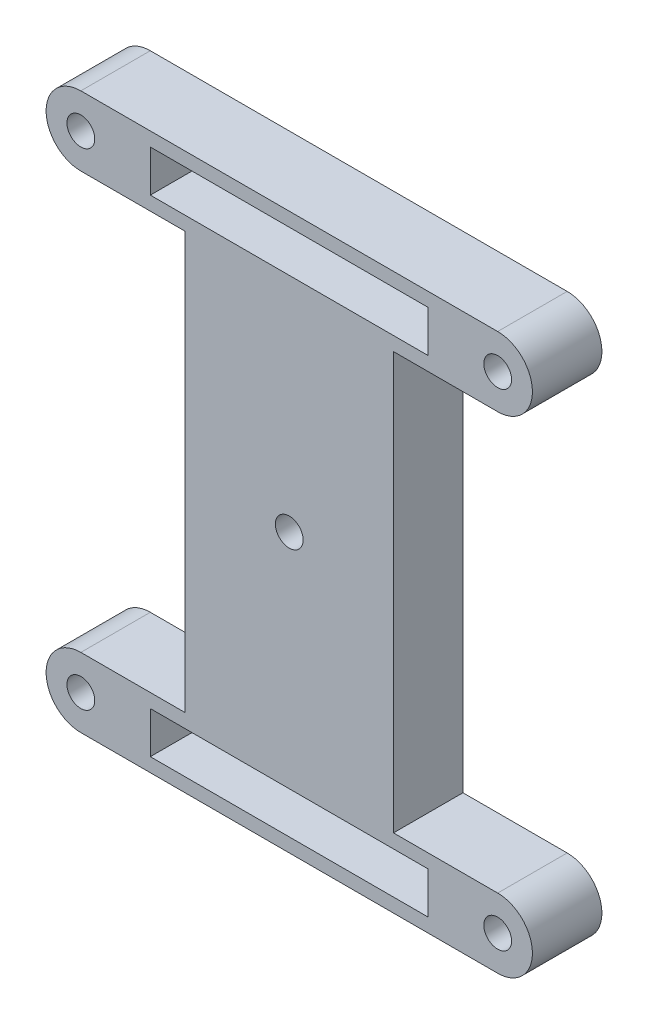
ISO-10303-21;
HEADER;
FILE_DESCRIPTION(('STEP AP214'),'2;1');
FILE_NAME('part.step','',(''),(''),'','','');
FILE_SCHEMA(('AUTOMOTIVE_DESIGN { 1 0 10303 214 1 1 1 1 }'));
ENDSEC;
DATA;
#1=APPLICATION_CONTEXT('core data for automotive mechanical design processes');
#2=APPLICATION_PROTOCOL_DEFINITION('international standard','automotive_design',2000,#1);
#3=PRODUCT_CONTEXT('',#1,'mechanical');
#4=PRODUCT('Part','Part','',(#3));
#5=PRODUCT_RELATED_PRODUCT_CATEGORY('part','',(#4));
#6=PRODUCT_DEFINITION_FORMATION('','',#4);
#7=PRODUCT_DEFINITION_CONTEXT('part definition',#1,'design');
#8=PRODUCT_DEFINITION('design','',#6,#7);
#9=PRODUCT_DEFINITION_SHAPE('','',#8);
#10=(LENGTH_UNIT() NAMED_UNIT(*) SI_UNIT(.MILLI.,.METRE.));
#11=(NAMED_UNIT(*) PLANE_ANGLE_UNIT() SI_UNIT($,.RADIAN.));
#12=(NAMED_UNIT(*) SI_UNIT($,.STERADIAN.) SOLID_ANGLE_UNIT());
#13=UNCERTAINTY_MEASURE_WITH_UNIT(LENGTH_MEASURE(1.E-05),#10,'distance_accuracy_value','');
#14=(GEOMETRIC_REPRESENTATION_CONTEXT(3) GLOBAL_UNCERTAINTY_ASSIGNED_CONTEXT((#13)) GLOBAL_UNIT_ASSIGNED_CONTEXT((#10,
#11,#12)) REPRESENTATION_CONTEXT('',''));
#15=CARTESIAN_POINT('',(0.,0.,0.));
#16=DIRECTION('',(0.,0.,1.));
#17=DIRECTION('',(1.,0.,0.));
#18=AXIS2_PLACEMENT_3D('',#15,#16,#17);
#19=CARTESIAN_POINT('',(15.,-17.5,2.5));
#20=DIRECTION('',(0.,0.,-1.));
#21=DIRECTION('',(-1.,0.,0.));
#22=AXIS2_PLACEMENT_3D('',#19,#20,#21);
#23=PLANE('',#22);
#24=DIRECTION('',(1.,0.,0.));
#25=VECTOR('',#24,1.);
#26=CARTESIAN_POINT('',(-10.,16.,2.5));
#27=LINE('',#26,#25);
#28=CARTESIAN_POINT('',(-10.,16.,2.5));
#29=VERTEX_POINT('',#28);
#30=CARTESIAN_POINT('',(10.,16.,2.5));
#31=VERTEX_POINT('',#30);
#32=EDGE_CURVE('E200',#29,#31,#27,.T.);
#33=ORIENTED_EDGE('',*,*,#32,.F.);
#34=DIRECTION('',(0.,-1.,0.));
#35=VECTOR('',#34,1.);
#36=CARTESIAN_POINT('',(-10.,19.,2.5));
#37=LINE('',#36,#35);
#38=CARTESIAN_POINT('',(-10.,19.,2.5));
#39=VERTEX_POINT('',#38);
#40=EDGE_CURVE('E48',#39,#29,#37,.T.);
#41=ORIENTED_EDGE('',*,*,#40,.F.);
#42=DIRECTION('',(-1.,0.,0.));
#43=VECTOR('',#42,1.);
#44=CARTESIAN_POINT('',(-10.,19.,2.5));
#45=LINE('',#44,#43);
#46=CARTESIAN_POINT('',(10.,19.,2.5));
#47=VERTEX_POINT('',#46);
#48=EDGE_CURVE('E191',#47,#39,#45,.T.);
#49=ORIENTED_EDGE('',*,*,#48,.F.);
#50=DIRECTION('',(0.,1.,0.));
#51=VECTOR('',#50,1.);
#52=CARTESIAN_POINT('',(10.,19.,2.5));
#53=LINE('',#52,#51);
#54=EDGE_CURVE('E194',#31,#47,#53,.T.);
#55=ORIENTED_EDGE('',*,*,#54,.F.);
#56=EDGE_LOOP('',(#33,#41,#49,#55));
#57=FACE_BOUND('',#56,.T.);
#58=DIRECTION('',(0.,1.,0.));
#59=VECTOR('',#58,1.);
#60=CARTESIAN_POINT('',(9.99999999999997,-19.,2.5));
#61=LINE('',#60,#59);
#62=CARTESIAN_POINT('',(9.99999999999997,-19.,2.5));
#63=VERTEX_POINT('',#62);
#64=CARTESIAN_POINT('',(9.99999999999998,-16.,2.5));
#65=VERTEX_POINT('',#64);
#66=EDGE_CURVE('E226',#63,#65,#61,.T.);
#67=ORIENTED_EDGE('',*,*,#66,.F.);
#68=DIRECTION('',(1.,0.,0.));
#69=VECTOR('',#68,1.);
#70=CARTESIAN_POINT('',(-10.,-19.,2.5));
#71=LINE('',#70,#69);
#72=CARTESIAN_POINT('',(-10.,-19.,2.5));
#73=VERTEX_POINT('',#72);
#74=EDGE_CURVE('E56',#73,#63,#71,.T.);
#75=ORIENTED_EDGE('',*,*,#74,.F.);
#76=DIRECTION('',(0.,-1.,0.));
#77=VECTOR('',#76,1.);
#78=CARTESIAN_POINT('',(-10.,-19.,2.5));
#79=LINE('',#78,#77);
#80=CARTESIAN_POINT('',(-10.,-16.,2.5));
#81=VERTEX_POINT('',#80);
#82=EDGE_CURVE('E215',#81,#73,#79,.T.);
#83=ORIENTED_EDGE('',*,*,#82,.F.);
#84=DIRECTION('',(-1.,0.,0.));
#85=VECTOR('',#84,1.);
#86=CARTESIAN_POINT('',(-10.,-16.,2.5));
#87=LINE('',#86,#85);
#88=EDGE_CURVE('E229',#65,#81,#87,.T.);
#89=ORIENTED_EDGE('',*,*,#88,.F.);
#90=EDGE_LOOP('',(#67,#75,#83,#89));
#91=FACE_BOUND('',#90,.T.);
#92=CARTESIAN_POINT('',(0.,0.,2.5));
#93=DIRECTION('',(0.,0.,1.));
#94=DIRECTION('',(1.,0.,0.));
#95=AXIS2_PLACEMENT_3D('',#92,#93,#94);
#96=CIRCLE('',#95,1.);
#97=CARTESIAN_POINT('',(1.,0.,2.5));
#98=VERTEX_POINT('',#97);
#99=EDGE_CURVE('E207',#98,#98,#96,.T.);
#100=ORIENTED_EDGE('',*,*,#99,.F.);
#101=EDGE_LOOP('',(#100));
#102=FACE_BOUND('',#101,.T.);
#103=DIRECTION('',(-1.,0.,0.));
#104=VECTOR('',#103,1.);
#105=CARTESIAN_POINT('',(7.5,-15.,2.5));
#106=LINE('',#105,#104);
#107=CARTESIAN_POINT('',(15.,-15.,2.5));
#108=VERTEX_POINT('',#107);
#109=CARTESIAN_POINT('',(7.5,-15.,2.5));
#110=VERTEX_POINT('',#109);
#111=EDGE_CURVE('E270',#108,#110,#106,.T.);
#112=ORIENTED_EDGE('',*,*,#111,.T.);
#113=DIRECTION('',(0.,1.,0.));
#114=VECTOR('',#113,1.);
#115=CARTESIAN_POINT('',(7.5,15.,2.5));
#116=LINE('',#115,#114);
#117=CARTESIAN_POINT('',(7.5,15.,2.5));
#118=VERTEX_POINT('',#117);
#119=EDGE_CURVE('E273',#110,#118,#116,.T.);
#120=ORIENTED_EDGE('',*,*,#119,.T.);
#121=DIRECTION('',(1.,0.,0.));
#122=VECTOR('',#121,1.);
#123=CARTESIAN_POINT('',(7.5,15.,2.5));
#124=LINE('',#123,#122);
#125=CARTESIAN_POINT('',(15.,15.,2.5));
#126=VERTEX_POINT('',#125);
#127=EDGE_CURVE('E276',#118,#126,#124,.T.);
#128=ORIENTED_EDGE('',*,*,#127,.T.);
#129=CARTESIAN_POINT('',(15.,17.5,2.5));
#130=DIRECTION('',(0.,0.,1.));
#131=DIRECTION('',(1.,0.,0.));
#132=AXIS2_PLACEMENT_3D('',#129,#130,#131);
#133=CIRCLE('',#132,2.5);
#134=CARTESIAN_POINT('',(15.,20.,2.5));
#135=VERTEX_POINT('',#134);
#136=EDGE_CURVE('E278',#126,#135,#133,.T.);
#137=ORIENTED_EDGE('',*,*,#136,.T.);
#138=DIRECTION('',(-1.,0.,0.));
#139=VECTOR('',#138,1.);
#140=CARTESIAN_POINT('',(-15.,20.,2.5));
#141=LINE('',#140,#139);
#142=CARTESIAN_POINT('',(-15.,20.,2.5));
#143=VERTEX_POINT('',#142);
#144=EDGE_CURVE('E280',#135,#143,#141,.T.);
#145=ORIENTED_EDGE('',*,*,#144,.T.);
#146=CARTESIAN_POINT('',(-15.,17.5,2.5));
#147=DIRECTION('',(0.,0.,1.));
#148=DIRECTION('',(1.,0.,0.));
#149=AXIS2_PLACEMENT_3D('',#146,#147,#148);
#150=CIRCLE('',#149,2.5);
#151=CARTESIAN_POINT('',(-15.,15.,2.5));
#152=VERTEX_POINT('',#151);
#153=EDGE_CURVE('E282',#143,#152,#150,.T.);
#154=ORIENTED_EDGE('',*,*,#153,.T.);
#155=DIRECTION('',(1.,0.,0.));
#156=VECTOR('',#155,1.);
#157=CARTESIAN_POINT('',(-15.,15.,2.5));
#158=LINE('',#157,#156);
#159=CARTESIAN_POINT('',(-7.5,15.,2.5));
#160=VERTEX_POINT('',#159);
#161=EDGE_CURVE('E284',#152,#160,#158,.T.);
#162=ORIENTED_EDGE('',*,*,#161,.T.);
#163=DIRECTION('',(0.,-1.,0.));
#164=VECTOR('',#163,1.);
#165=CARTESIAN_POINT('',(-7.5,15.,2.5));
#166=LINE('',#165,#164);
#167=CARTESIAN_POINT('',(-7.5,-15.,2.5));
#168=VERTEX_POINT('',#167);
#169=EDGE_CURVE('E286',#160,#168,#166,.T.);
#170=ORIENTED_EDGE('',*,*,#169,.T.);
#171=DIRECTION('',(-1.,0.,0.));
#172=VECTOR('',#171,1.);
#173=CARTESIAN_POINT('',(-15.,-15.,2.5));
#174=LINE('',#173,#172);
#175=CARTESIAN_POINT('',(-15.,-15.,2.5));
#176=VERTEX_POINT('',#175);
#177=EDGE_CURVE('E288',#168,#176,#174,.T.);
#178=ORIENTED_EDGE('',*,*,#177,.T.);
#179=CARTESIAN_POINT('',(-15.,-17.5,2.5));
#180=DIRECTION('',(0.,0.,1.));
#181=DIRECTION('',(-1.,0.,0.));
#182=AXIS2_PLACEMENT_3D('',#179,#180,#181);
#183=CIRCLE('',#182,2.5);
#184=CARTESIAN_POINT('',(-15.,-20.,2.5));
#185=VERTEX_POINT('',#184);
#186=EDGE_CURVE('E290',#176,#185,#183,.T.);
#187=ORIENTED_EDGE('',*,*,#186,.T.);
#188=DIRECTION('',(1.,0.,0.));
#189=VECTOR('',#188,1.);
#190=CARTESIAN_POINT('',(-15.,-20.,2.5));
#191=LINE('',#190,#189);
#192=CARTESIAN_POINT('',(15.,-20.,2.5));
#193=VERTEX_POINT('',#192);
#194=EDGE_CURVE('E292',#185,#193,#191,.T.);
#195=ORIENTED_EDGE('',*,*,#194,.T.);
#196=CARTESIAN_POINT('',(15.,-17.5,2.5));
#197=DIRECTION('',(0.,0.,1.));
#198=DIRECTION('',(-1.,0.,0.));
#199=AXIS2_PLACEMENT_3D('',#196,#197,#198);
#200=CIRCLE('',#199,2.5);
#201=EDGE_CURVE('E294',#193,#108,#200,.T.);
#202=ORIENTED_EDGE('',*,*,#201,.T.);
#203=EDGE_LOOP('',(#112,#120,#128,#137,#145,#154,#162,#170,#178,#187,#195,#202));
#204=FACE_BOUND('',#203,.T.);
#205=CARTESIAN_POINT('',(15.,17.5,2.5));
#206=DIRECTION('',(0.,0.,1.));
#207=DIRECTION('',(1.,0.,0.));
#208=AXIS2_PLACEMENT_3D('',#205,#206,#207);
#209=CIRCLE('',#208,1.);
#210=CARTESIAN_POINT('',(16.,17.5,2.5));
#211=VERTEX_POINT('',#210);
#212=EDGE_CURVE('E264',#211,#211,#209,.T.);
#213=ORIENTED_EDGE('',*,*,#212,.F.);
#214=EDGE_LOOP('',(#213));
#215=FACE_BOUND('',#214,.T.);
#216=CARTESIAN_POINT('',(15.,-17.5,2.5));
#217=DIRECTION('',(0.,0.,1.));
#218=DIRECTION('',(-1.,0.,0.));
#219=AXIS2_PLACEMENT_3D('',#216,#217,#218);
#220=CIRCLE('',#219,1.);
#221=CARTESIAN_POINT('',(14.,-17.5,2.5));
#222=VERTEX_POINT('',#221);
#223=EDGE_CURVE('E258',#222,#222,#220,.T.);
#224=ORIENTED_EDGE('',*,*,#223,.F.);
#225=EDGE_LOOP('',(#224));
#226=FACE_BOUND('',#225,.T.);
#227=CARTESIAN_POINT('',(-15.,-17.5,2.5));
#228=DIRECTION('',(0.,0.,1.));
#229=DIRECTION('',(-1.,0.,0.));
#230=AXIS2_PLACEMENT_3D('',#227,#228,#229);
#231=CIRCLE('',#230,1.);
#232=CARTESIAN_POINT('',(-16.,-17.5,2.5));
#233=VERTEX_POINT('',#232);
#234=EDGE_CURVE('E252',#233,#233,#231,.T.);
#235=ORIENTED_EDGE('',*,*,#234,.F.);
#236=EDGE_LOOP('',(#235));
#237=FACE_BOUND('',#236,.T.);
#238=CARTESIAN_POINT('',(-15.,17.5,2.5));
#239=DIRECTION('',(0.,0.,1.));
#240=DIRECTION('',(1.,0.,0.));
#241=AXIS2_PLACEMENT_3D('',#238,#239,#240);
#242=CIRCLE('',#241,1.);
#243=CARTESIAN_POINT('',(-14.,17.5,2.5));
#244=VERTEX_POINT('',#243);
#245=EDGE_CURVE('E246',#244,#244,#242,.T.);
#246=ORIENTED_EDGE('',*,*,#245,.F.);
#247=EDGE_LOOP('',(#246));
#248=FACE_BOUND('',#247,.T.);
#249=ADVANCED_FACE('F33',(#57,#91,#102,#204,#215,#226,#237,#248),#23,.F.);
#250=CARTESIAN_POINT('',(15.,-17.5,-2.5));
#251=DIRECTION('',(0.,0.,-1.));
#252=DIRECTION('',(-1.,0.,0.));
#253=AXIS2_PLACEMENT_3D('',#250,#251,#252);
#254=PLANE('',#253);
#255=DIRECTION('',(0.,-1.,0.));
#256=VECTOR('',#255,1.);
#257=CARTESIAN_POINT('',(-10.,19.,-2.5));
#258=LINE('',#257,#256);
#259=CARTESIAN_POINT('',(-10.,19.,-2.5));
#260=VERTEX_POINT('',#259);
#261=CARTESIAN_POINT('',(-10.,16.,-2.5));
#262=VERTEX_POINT('',#261);
#263=EDGE_CURVE('E172',#260,#262,#258,.T.);
#264=ORIENTED_EDGE('',*,*,#263,.T.);
#265=DIRECTION('',(1.,0.,0.));
#266=VECTOR('',#265,1.);
#267=CARTESIAN_POINT('',(-10.,16.,-2.5));
#268=LINE('',#267,#266);
#269=CARTESIAN_POINT('',(10.,16.,-2.5));
#270=VERTEX_POINT('',#269);
#271=EDGE_CURVE('E182',#262,#270,#268,.T.);
#272=ORIENTED_EDGE('',*,*,#271,.T.);
#273=DIRECTION('',(0.,1.,0.));
#274=VECTOR('',#273,1.);
#275=CARTESIAN_POINT('',(10.,19.,-2.5));
#276=LINE('',#275,#274);
#277=CARTESIAN_POINT('',(10.,19.,-2.5));
#278=VERTEX_POINT('',#277);
#279=EDGE_CURVE('E186',#270,#278,#276,.T.);
#280=ORIENTED_EDGE('',*,*,#279,.T.);
#281=DIRECTION('',(-1.,0.,0.));
#282=VECTOR('',#281,1.);
#283=CARTESIAN_POINT('',(-10.,19.,-2.5));
#284=LINE('',#283,#282);
#285=EDGE_CURVE('E178',#278,#260,#284,.T.);
#286=ORIENTED_EDGE('',*,*,#285,.T.);
#287=EDGE_LOOP('',(#264,#272,#280,#286));
#288=FACE_BOUND('',#287,.T.);
#289=DIRECTION('',(1.,0.,0.));
#290=VECTOR('',#289,1.);
#291=CARTESIAN_POINT('',(-10.,-19.,-2.5));
#292=LINE('',#291,#290);
#293=CARTESIAN_POINT('',(-10.,-19.,-2.5));
#294=VERTEX_POINT('',#293);
#295=CARTESIAN_POINT('',(9.99999999999997,-19.,-2.5));
#296=VERTEX_POINT('',#295);
#297=EDGE_CURVE('E211',#294,#296,#292,.T.);
#298=ORIENTED_EDGE('',*,*,#297,.T.);
#299=DIRECTION('',(0.,1.,0.));
#300=VECTOR('',#299,1.);
#301=CARTESIAN_POINT('',(9.99999999999997,-19.,-2.5));
#302=LINE('',#301,#300);
#303=CARTESIAN_POINT('',(9.99999999999998,-16.,-2.5));
#304=VERTEX_POINT('',#303);
#305=EDGE_CURVE('E214',#296,#304,#302,.T.);
#306=ORIENTED_EDGE('',*,*,#305,.T.);
#307=DIRECTION('',(-1.,0.,0.));
#308=VECTOR('',#307,1.);
#309=CARTESIAN_POINT('',(-10.,-16.,-2.5));
#310=LINE('',#309,#308);
#311=CARTESIAN_POINT('',(-10.,-16.,-2.5));
#312=VERTEX_POINT('',#311);
#313=EDGE_CURVE('E218',#304,#312,#310,.T.);
#314=ORIENTED_EDGE('',*,*,#313,.T.);
#315=DIRECTION('',(0.,-1.,0.));
#316=VECTOR('',#315,1.);
#317=CARTESIAN_POINT('',(-10.,-19.,-2.5));
#318=LINE('',#317,#316);
#319=EDGE_CURVE('E221',#312,#294,#318,.T.);
#320=ORIENTED_EDGE('',*,*,#319,.T.);
#321=EDGE_LOOP('',(#298,#306,#314,#320));
#322=FACE_BOUND('',#321,.T.);
#323=CARTESIAN_POINT('',(0.,0.,-2.5));
#324=DIRECTION('',(0.,0.,1.));
#325=DIRECTION('',(1.,0.,0.));
#326=AXIS2_PLACEMENT_3D('',#323,#324,#325);
#327=CIRCLE('',#326,1.);
#328=CARTESIAN_POINT('',(1.,0.,-2.5));
#329=VERTEX_POINT('',#328);
#330=EDGE_CURVE('E240',#329,#329,#327,.T.);
#331=ORIENTED_EDGE('',*,*,#330,.T.);
#332=EDGE_LOOP('',(#331));
#333=FACE_BOUND('',#332,.T.);
#334=CARTESIAN_POINT('',(-15.,-17.5,-2.5));
#335=DIRECTION('',(0.,0.,1.));
#336=DIRECTION('',(-1.,0.,0.));
#337=AXIS2_PLACEMENT_3D('',#334,#335,#336);
#338=CIRCLE('',#337,1.);
#339=CARTESIAN_POINT('',(-16.,-17.5,-2.5));
#340=VERTEX_POINT('',#339);
#341=EDGE_CURVE('E249',#340,#340,#338,.T.);
#342=ORIENTED_EDGE('',*,*,#341,.T.);
#343=EDGE_LOOP('',(#342));
#344=FACE_BOUND('',#343,.T.);
#345=CARTESIAN_POINT('',(15.,17.5,-2.5));
#346=DIRECTION('',(0.,0.,1.));
#347=DIRECTION('',(1.,0.,0.));
#348=AXIS2_PLACEMENT_3D('',#345,#346,#347);
#349=CIRCLE('',#348,1.);
#350=CARTESIAN_POINT('',(16.,17.5,-2.5));
#351=VERTEX_POINT('',#350);
#352=EDGE_CURVE('E261',#351,#351,#349,.T.);
#353=ORIENTED_EDGE('',*,*,#352,.T.);
#354=EDGE_LOOP('',(#353));
#355=FACE_BOUND('',#354,.T.);
#356=DIRECTION('',(-1.,0.,0.));
#357=VECTOR('',#356,1.);
#358=CARTESIAN_POINT('',(7.5,-15.,-2.5));
#359=LINE('',#358,#357);
#360=CARTESIAN_POINT('',(15.,-15.,-2.5));
#361=VERTEX_POINT('',#360);
#362=CARTESIAN_POINT('',(7.5,-15.,-2.5));
#363=VERTEX_POINT('',#362);
#364=EDGE_CURVE('E267',#361,#363,#359,.T.);
#365=ORIENTED_EDGE('',*,*,#364,.F.);
#366=CARTESIAN_POINT('',(15.,-17.5,-2.5));
#367=DIRECTION('',(0.,0.,1.));
#368=DIRECTION('',(-1.,0.,0.));
#369=AXIS2_PLACEMENT_3D('',#366,#367,#368);
#370=CIRCLE('',#369,2.5);
#371=CARTESIAN_POINT('',(15.,-20.,-2.5));
#372=VERTEX_POINT('',#371);
#373=EDGE_CURVE('E274',#372,#361,#370,.T.);
#374=ORIENTED_EDGE('',*,*,#373,.F.);
#375=DIRECTION('',(1.,0.,0.));
#376=VECTOR('',#375,1.);
#377=CARTESIAN_POINT('',(-15.,-20.,-2.5));
#378=LINE('',#377,#376);
#379=CARTESIAN_POINT('',(-15.,-20.,-2.5));
#380=VERTEX_POINT('',#379);
#381=EDGE_CURVE('E317',#380,#372,#378,.T.);
#382=ORIENTED_EDGE('',*,*,#381,.F.);
#383=CARTESIAN_POINT('',(-15.,-17.5,-2.5));
#384=DIRECTION('',(0.,0.,1.));
#385=DIRECTION('',(-1.,0.,0.));
#386=AXIS2_PLACEMENT_3D('',#383,#384,#385);
#387=CIRCLE('',#386,2.5);
#388=CARTESIAN_POINT('',(-15.,-15.,-2.5));
#389=VERTEX_POINT('',#388);
#390=EDGE_CURVE('E315',#389,#380,#387,.T.);
#391=ORIENTED_EDGE('',*,*,#390,.F.);
#392=DIRECTION('',(-1.,0.,0.));
#393=VECTOR('',#392,1.);
#394=CARTESIAN_POINT('',(-15.,-15.,-2.5));
#395=LINE('',#394,#393);
#396=CARTESIAN_POINT('',(-7.5,-15.,-2.5));
#397=VERTEX_POINT('',#396);
#398=EDGE_CURVE('E313',#397,#389,#395,.T.);
#399=ORIENTED_EDGE('',*,*,#398,.F.);
#400=DIRECTION('',(0.,-1.,0.));
#401=VECTOR('',#400,1.);
#402=CARTESIAN_POINT('',(-7.5,15.,-2.5));
#403=LINE('',#402,#401);
#404=CARTESIAN_POINT('',(-7.5,15.,-2.5));
#405=VERTEX_POINT('',#404);
#406=EDGE_CURVE('E311',#405,#397,#403,.T.);
#407=ORIENTED_EDGE('',*,*,#406,.F.);
#408=DIRECTION('',(1.,0.,0.));
#409=VECTOR('',#408,1.);
#410=CARTESIAN_POINT('',(-15.,15.,-2.5));
#411=LINE('',#410,#409);
#412=CARTESIAN_POINT('',(-15.,15.,-2.5));
#413=VERTEX_POINT('',#412);
#414=EDGE_CURVE('E309',#413,#405,#411,.T.);
#415=ORIENTED_EDGE('',*,*,#414,.F.);
#416=CARTESIAN_POINT('',(-15.,17.5,-2.5));
#417=DIRECTION('',(0.,0.,1.));
#418=DIRECTION('',(1.,0.,0.));
#419=AXIS2_PLACEMENT_3D('',#416,#417,#418);
#420=CIRCLE('',#419,2.5);
#421=CARTESIAN_POINT('',(-15.,20.,-2.5));
#422=VERTEX_POINT('',#421);
#423=EDGE_CURVE('E307',#422,#413,#420,.T.);
#424=ORIENTED_EDGE('',*,*,#423,.F.);
#425=DIRECTION('',(-1.,0.,0.));
#426=VECTOR('',#425,1.);
#427=CARTESIAN_POINT('',(-15.,20.,-2.5));
#428=LINE('',#427,#426);
#429=CARTESIAN_POINT('',(15.,20.,-2.5));
#430=VERTEX_POINT('',#429);
#431=EDGE_CURVE('E305',#430,#422,#428,.T.);
#432=ORIENTED_EDGE('',*,*,#431,.F.);
#433=CARTESIAN_POINT('',(15.,17.5,-2.5));
#434=DIRECTION('',(0.,0.,1.));
#435=DIRECTION('',(1.,0.,0.));
#436=AXIS2_PLACEMENT_3D('',#433,#434,#435);
#437=CIRCLE('',#436,2.5);
#438=CARTESIAN_POINT('',(15.,15.,-2.5));
#439=VERTEX_POINT('',#438);
#440=EDGE_CURVE('E303',#439,#430,#437,.T.);
#441=ORIENTED_EDGE('',*,*,#440,.F.);
#442=DIRECTION('',(1.,0.,0.));
#443=VECTOR('',#442,1.);
#444=CARTESIAN_POINT('',(7.5,15.,-2.5));
#445=LINE('',#444,#443);
#446=CARTESIAN_POINT('',(7.5,15.,-2.5));
#447=VERTEX_POINT('',#446);
#448=EDGE_CURVE('E301',#447,#439,#445,.T.);
#449=ORIENTED_EDGE('',*,*,#448,.F.);
#450=DIRECTION('',(0.,1.,0.));
#451=VECTOR('',#450,1.);
#452=CARTESIAN_POINT('',(7.5,15.,-2.5));
#453=LINE('',#452,#451);
#454=EDGE_CURVE('E299',#363,#447,#453,.T.);
#455=ORIENTED_EDGE('',*,*,#454,.F.);
#456=EDGE_LOOP('',(#365,#374,#382,#391,#399,#407,#415,#424,#432,#441,#449,#455));
#457=FACE_BOUND('',#456,.T.);
#458=CARTESIAN_POINT('',(15.,-17.5,-2.5));
#459=DIRECTION('',(0.,0.,1.));
#460=DIRECTION('',(-1.,0.,0.));
#461=AXIS2_PLACEMENT_3D('',#458,#459,#460);
#462=CIRCLE('',#461,1.);
#463=CARTESIAN_POINT('',(14.,-17.5,-2.5));
#464=VERTEX_POINT('',#463);
#465=EDGE_CURVE('E255',#464,#464,#462,.T.);
#466=ORIENTED_EDGE('',*,*,#465,.T.);
#467=EDGE_LOOP('',(#466));
#468=FACE_BOUND('',#467,.T.);
#469=CARTESIAN_POINT('',(-15.,17.5,-2.5));
#470=DIRECTION('',(0.,0.,1.));
#471=DIRECTION('',(1.,0.,0.));
#472=AXIS2_PLACEMENT_3D('',#469,#470,#471);
#473=CIRCLE('',#472,1.);
#474=CARTESIAN_POINT('',(-14.,17.5,-2.5));
#475=VERTEX_POINT('',#474);
#476=EDGE_CURVE('E243',#475,#475,#473,.T.);
#477=ORIENTED_EDGE('',*,*,#476,.T.);
#478=EDGE_LOOP('',(#477));
#479=FACE_BOUND('',#478,.T.);
#480=ADVANCED_FACE('F188',(#288,#322,#333,#344,#355,#457,#468,#479),#254,.T.);
#481=CARTESIAN_POINT('',(7.5,-15.,2.5));
#482=DIRECTION('',(0.,-1.,0.));
#483=DIRECTION('',(1.,0.,0.));
#484=AXIS2_PLACEMENT_3D('',#481,#482,#483);
#485=PLANE('',#484);
#486=ORIENTED_EDGE('',*,*,#364,.T.);
#487=DIRECTION('',(0.,0.,-1.));
#488=VECTOR('',#487,1.);
#489=CARTESIAN_POINT('',(7.5,-15.,2.5));
#490=LINE('',#489,#488);
#491=EDGE_CURVE('E11',#110,#363,#490,.T.);
#492=ORIENTED_EDGE('',*,*,#491,.F.);
#493=ORIENTED_EDGE('',*,*,#111,.F.);
#494=DIRECTION('',(0.,0.,-1.));
#495=VECTOR('',#494,1.);
#496=CARTESIAN_POINT('',(15.,-15.,2.5));
#497=LINE('',#496,#495);
#498=EDGE_CURVE('E296',#108,#361,#497,.T.);
#499=ORIENTED_EDGE('',*,*,#498,.T.);
#500=EDGE_LOOP('',(#486,#492,#493,#499));
#501=FACE_BOUND('',#500,.T.);
#502=ADVANCED_FACE('F35',(#501),#485,.F.);
#503=CARTESIAN_POINT('',(7.5,15.,2.5));
#504=DIRECTION('',(-1.,0.,0.));
#505=DIRECTION('',(0.,-1.,0.));
#506=AXIS2_PLACEMENT_3D('',#503,#504,#505);
#507=PLANE('',#506);
#508=ORIENTED_EDGE('',*,*,#454,.T.);
#509=DIRECTION('',(0.,0.,-1.));
#510=VECTOR('',#509,1.);
#511=CARTESIAN_POINT('',(7.5,15.,2.5));
#512=LINE('',#511,#510);
#513=EDGE_CURVE('E41',#118,#447,#512,.T.);
#514=ORIENTED_EDGE('',*,*,#513,.F.);
#515=ORIENTED_EDGE('',*,*,#119,.F.);
#516=ORIENTED_EDGE('',*,*,#491,.T.);
#517=EDGE_LOOP('',(#508,#514,#515,#516));
#518=FACE_BOUND('',#517,.T.);
#519=ADVANCED_FACE('F376',(#518),#507,.F.);
#520=CARTESIAN_POINT('',(7.5,15.,2.5));
#521=DIRECTION('',(0.,1.,0.));
#522=DIRECTION('',(-1.,0.,0.));
#523=AXIS2_PLACEMENT_3D('',#520,#521,#522);
#524=PLANE('',#523);
#525=ORIENTED_EDGE('',*,*,#448,.T.);
#526=DIRECTION('',(0.,0.,-1.));
#527=VECTOR('',#526,1.);
#528=CARTESIAN_POINT('',(15.,15.,2.5));
#529=LINE('',#528,#527);
#530=EDGE_CURVE('E346',#126,#439,#529,.T.);
#531=ORIENTED_EDGE('',*,*,#530,.F.);
#532=ORIENTED_EDGE('',*,*,#127,.F.);
#533=ORIENTED_EDGE('',*,*,#513,.T.);
#534=EDGE_LOOP('',(#525,#531,#532,#533));
#535=FACE_BOUND('',#534,.T.);
#536=ADVANCED_FACE('F353',(#535),#524,.F.);
#537=CARTESIAN_POINT('',(15.,17.5,2.5));
#538=DIRECTION('',(0.,0.,-1.));
#539=DIRECTION('',(-1.,0.,0.));
#540=AXIS2_PLACEMENT_3D('',#537,#538,#539);
#541=CYLINDRICAL_SURFACE('',#540,2.5);
#542=ORIENTED_EDGE('',*,*,#440,.T.);
#543=DIRECTION('',(0.,0.,-1.));
#544=VECTOR('',#543,1.);
#545=CARTESIAN_POINT('',(15.,20.,2.5));
#546=LINE('',#545,#544);
#547=EDGE_CURVE('E343',#135,#430,#546,.T.);
#548=ORIENTED_EDGE('',*,*,#547,.F.);
#549=ORIENTED_EDGE('',*,*,#136,.F.);
#550=ORIENTED_EDGE('',*,*,#530,.T.);
#551=EDGE_LOOP('',(#542,#548,#549,#550));
#552=FACE_BOUND('',#551,.T.);
#553=ADVANCED_FACE('F364',(#552),#541,.T.);
#554=CARTESIAN_POINT('',(-15.,20.,2.5));
#555=DIRECTION('',(0.,-1.,0.));
#556=DIRECTION('',(0.,0.,-1.));
#557=AXIS2_PLACEMENT_3D('',#554,#555,#556);
#558=PLANE('',#557);
#559=ORIENTED_EDGE('',*,*,#431,.T.);
#560=DIRECTION('',(0.,0.,-1.));
#561=VECTOR('',#560,1.);
#562=CARTESIAN_POINT('',(-15.,20.,2.5));
#563=LINE('',#562,#561);
#564=EDGE_CURVE('E340',#143,#422,#563,.T.);
#565=ORIENTED_EDGE('',*,*,#564,.F.);
#566=ORIENTED_EDGE('',*,*,#144,.F.);
#567=ORIENTED_EDGE('',*,*,#547,.T.);
#568=EDGE_LOOP('',(#559,#565,#566,#567));
#569=FACE_BOUND('',#568,.T.);
#570=ADVANCED_FACE('F368',(#569),#558,.F.);
#571=CARTESIAN_POINT('',(-15.,17.5,2.5));
#572=DIRECTION('',(0.,0.,-1.));
#573=DIRECTION('',(-1.,0.,0.));
#574=AXIS2_PLACEMENT_3D('',#571,#572,#573);
#575=CYLINDRICAL_SURFACE('',#574,2.5);
#576=ORIENTED_EDGE('',*,*,#423,.T.);
#577=DIRECTION('',(0.,0.,-1.));
#578=VECTOR('',#577,1.);
#579=CARTESIAN_POINT('',(-15.,15.,2.5));
#580=LINE('',#579,#578);
#581=EDGE_CURVE('E337',#152,#413,#580,.T.);
#582=ORIENTED_EDGE('',*,*,#581,.F.);
#583=ORIENTED_EDGE('',*,*,#153,.F.);
#584=ORIENTED_EDGE('',*,*,#564,.T.);
#585=EDGE_LOOP('',(#576,#582,#583,#584));
#586=FACE_BOUND('',#585,.T.);
#587=ADVANCED_FACE('F409',(#586),#575,.T.);
#588=CARTESIAN_POINT('',(-15.,15.,2.5));
#589=DIRECTION('',(0.,1.,0.));
#590=DIRECTION('',(0.,0.,1.));
#591=AXIS2_PLACEMENT_3D('',#588,#589,#590);
#592=PLANE('',#591);
#593=ORIENTED_EDGE('',*,*,#414,.T.);
#594=DIRECTION('',(0.,0.,-1.));
#595=VECTOR('',#594,1.);
#596=CARTESIAN_POINT('',(-7.5,15.,2.5));
#597=LINE('',#596,#595);
#598=EDGE_CURVE('E334',#160,#405,#597,.T.);
#599=ORIENTED_EDGE('',*,*,#598,.F.);
#600=ORIENTED_EDGE('',*,*,#161,.F.);
#601=ORIENTED_EDGE('',*,*,#581,.T.);
#602=EDGE_LOOP('',(#593,#599,#600,#601));
#603=FACE_BOUND('',#602,.T.);
#604=ADVANCED_FACE('F407',(#603),#592,.F.);
#605=CARTESIAN_POINT('',(-7.5,15.,2.5));
#606=DIRECTION('',(1.,0.,0.));
#607=DIRECTION('',(0.,1.,0.));
#608=AXIS2_PLACEMENT_3D('',#605,#606,#607);
#609=PLANE('',#608);
#610=ORIENTED_EDGE('',*,*,#406,.T.);
#611=DIRECTION('',(0.,0.,-1.));
#612=VECTOR('',#611,1.);
#613=CARTESIAN_POINT('',(-7.5,-15.,2.5));
#614=LINE('',#613,#612);
#615=EDGE_CURVE('E331',#168,#397,#614,.T.);
#616=ORIENTED_EDGE('',*,*,#615,.F.);
#617=ORIENTED_EDGE('',*,*,#169,.F.);
#618=ORIENTED_EDGE('',*,*,#598,.T.);
#619=EDGE_LOOP('',(#610,#616,#617,#618));
#620=FACE_BOUND('',#619,.T.);
#621=ADVANCED_FACE('F403',(#620),#609,.F.);
#622=CARTESIAN_POINT('',(-15.,-15.,2.5));
#623=DIRECTION('',(0.,-1.,0.));
#624=DIRECTION('',(1.,0.,0.));
#625=AXIS2_PLACEMENT_3D('',#622,#623,#624);
#626=PLANE('',#625);
#627=ORIENTED_EDGE('',*,*,#398,.T.);
#628=DIRECTION('',(0.,0.,-1.));
#629=VECTOR('',#628,1.);
#630=CARTESIAN_POINT('',(-15.,-15.,2.5));
#631=LINE('',#630,#629);
#632=EDGE_CURVE('E328',#176,#389,#631,.T.);
#633=ORIENTED_EDGE('',*,*,#632,.F.);
#634=ORIENTED_EDGE('',*,*,#177,.F.);
#635=ORIENTED_EDGE('',*,*,#615,.T.);
#636=EDGE_LOOP('',(#627,#633,#634,#635));
#637=FACE_BOUND('',#636,.T.);
#638=ADVANCED_FACE('F398',(#637),#626,.F.);
#639=CARTESIAN_POINT('',(-15.,-17.5,2.5));
#640=DIRECTION('',(0.,0.,-1.));
#641=DIRECTION('',(-1.,0.,0.));
#642=AXIS2_PLACEMENT_3D('',#639,#640,#641);
#643=CYLINDRICAL_SURFACE('',#642,2.5);
#644=ORIENTED_EDGE('',*,*,#390,.T.);
#645=DIRECTION('',(0.,0.,-1.));
#646=VECTOR('',#645,1.);
#647=CARTESIAN_POINT('',(-15.,-20.,2.5));
#648=LINE('',#647,#646);
#649=EDGE_CURVE('E325',#185,#380,#648,.T.);
#650=ORIENTED_EDGE('',*,*,#649,.F.);
#651=ORIENTED_EDGE('',*,*,#186,.F.);
#652=ORIENTED_EDGE('',*,*,#632,.T.);
#653=EDGE_LOOP('',(#644,#650,#651,#652));
#654=FACE_BOUND('',#653,.T.);
#655=ADVANCED_FACE('F392',(#654),#643,.T.);
#656=CARTESIAN_POINT('',(-15.,-20.,2.5));
#657=DIRECTION('',(0.,1.,0.));
#658=DIRECTION('',(0.,0.,1.));
#659=AXIS2_PLACEMENT_3D('',#656,#657,#658);
#660=PLANE('',#659);
#661=ORIENTED_EDGE('',*,*,#381,.T.);
#662=DIRECTION('',(0.,0.,-1.));
#663=VECTOR('',#662,1.);
#664=CARTESIAN_POINT('',(15.,-20.,2.5));
#665=LINE('',#664,#663);
#666=EDGE_CURVE('E322',#193,#372,#665,.T.);
#667=ORIENTED_EDGE('',*,*,#666,.F.);
#668=ORIENTED_EDGE('',*,*,#194,.F.);
#669=ORIENTED_EDGE('',*,*,#649,.T.);
#670=EDGE_LOOP('',(#661,#667,#668,#669));
#671=FACE_BOUND('',#670,.T.);
#672=ADVANCED_FACE('F388',(#671),#660,.F.);
#673=CARTESIAN_POINT('',(15.,-17.5,2.5));
#674=DIRECTION('',(0.,0.,-1.));
#675=DIRECTION('',(-1.,0.,0.));
#676=AXIS2_PLACEMENT_3D('',#673,#674,#675);
#677=CYLINDRICAL_SURFACE('',#676,2.5);
#678=ORIENTED_EDGE('',*,*,#373,.T.);
#679=ORIENTED_EDGE('',*,*,#498,.F.);
#680=ORIENTED_EDGE('',*,*,#201,.F.);
#681=ORIENTED_EDGE('',*,*,#666,.T.);
#682=EDGE_LOOP('',(#678,#679,#680,#681));
#683=FACE_BOUND('',#682,.T.);
#684=ADVANCED_FACE('F383',(#683),#677,.T.);
#685=CARTESIAN_POINT('',(15.,17.5,2.5));
#686=DIRECTION('',(0.,0.,-1.));
#687=DIRECTION('',(-1.,0.,0.));
#688=AXIS2_PLACEMENT_3D('',#685,#686,#687);
#689=CYLINDRICAL_SURFACE('',#688,1.);
#690=ORIENTED_EDGE('',*,*,#212,.T.);
#691=EDGE_LOOP('',(#690));
#692=FACE_BOUND('',#691,.T.);
#693=ORIENTED_EDGE('',*,*,#352,.F.);
#694=EDGE_LOOP('',(#693));
#695=FACE_BOUND('',#694,.T.);
#696=ADVANCED_FACE('F427',(#692,#695),#689,.F.);
#697=CARTESIAN_POINT('',(15.,-17.5,2.5));
#698=DIRECTION('',(0.,0.,-1.));
#699=DIRECTION('',(-1.,0.,0.));
#700=AXIS2_PLACEMENT_3D('',#697,#698,#699);
#701=CYLINDRICAL_SURFACE('',#700,1.);
#702=ORIENTED_EDGE('',*,*,#223,.T.);
#703=EDGE_LOOP('',(#702));
#704=FACE_BOUND('',#703,.T.);
#705=ORIENTED_EDGE('',*,*,#465,.F.);
#706=EDGE_LOOP('',(#705));
#707=FACE_BOUND('',#706,.T.);
#708=ADVANCED_FACE('F465',(#704,#707),#701,.F.);
#709=CARTESIAN_POINT('',(-15.,-17.5,2.5));
#710=DIRECTION('',(0.,0.,-1.));
#711=DIRECTION('',(-1.,0.,0.));
#712=AXIS2_PLACEMENT_3D('',#709,#710,#711);
#713=CYLINDRICAL_SURFACE('',#712,1.);
#714=ORIENTED_EDGE('',*,*,#234,.T.);
#715=EDGE_LOOP('',(#714));
#716=FACE_BOUND('',#715,.T.);
#717=ORIENTED_EDGE('',*,*,#341,.F.);
#718=EDGE_LOOP('',(#717));
#719=FACE_BOUND('',#718,.T.);
#720=ADVANCED_FACE('F472',(#716,#719),#713,.F.);
#721=CARTESIAN_POINT('',(-15.,17.5,2.5));
#722=DIRECTION('',(0.,0.,-1.));
#723=DIRECTION('',(-1.,0.,0.));
#724=AXIS2_PLACEMENT_3D('',#721,#722,#723);
#725=CYLINDRICAL_SURFACE('',#724,1.);
#726=ORIENTED_EDGE('',*,*,#245,.T.);
#727=EDGE_LOOP('',(#726));
#728=FACE_BOUND('',#727,.T.);
#729=ORIENTED_EDGE('',*,*,#476,.F.);
#730=EDGE_LOOP('',(#729));
#731=FACE_BOUND('',#730,.T.);
#732=ADVANCED_FACE('F479',(#728,#731),#725,.F.);
#733=CARTESIAN_POINT('',(0.,0.,-2.5));
#734=DIRECTION('',(0.,0.,1.));
#735=DIRECTION('',(1.,0.,0.));
#736=AXIS2_PLACEMENT_3D('',#733,#734,#735);
#737=CYLINDRICAL_SURFACE('',#736,1.);
#738=ORIENTED_EDGE('',*,*,#330,.F.);
#739=EDGE_LOOP('',(#738));
#740=FACE_BOUND('',#739,.T.);
#741=ORIENTED_EDGE('',*,*,#99,.T.);
#742=EDGE_LOOP('',(#741));
#743=FACE_BOUND('',#742,.T.);
#744=ADVANCED_FACE('F487',(#740,#743),#737,.F.);
#745=CARTESIAN_POINT('',(-10.,-19.,-2.5));
#746=DIRECTION('',(0.,-1.,0.));
#747=DIRECTION('',(1.,0.,0.));
#748=AXIS2_PLACEMENT_3D('',#745,#746,#747);
#749=PLANE('',#748);
#750=ORIENTED_EDGE('',*,*,#74,.T.);
#751=DIRECTION('',(0.,0.,1.));
#752=VECTOR('',#751,1.);
#753=CARTESIAN_POINT('',(9.99999999999997,-19.,-2.5));
#754=LINE('',#753,#752);
#755=EDGE_CURVE('E224',#296,#63,#754,.T.);
#756=ORIENTED_EDGE('',*,*,#755,.F.);
#757=ORIENTED_EDGE('',*,*,#297,.F.);
#758=DIRECTION('',(0.,0.,1.));
#759=VECTOR('',#758,1.);
#760=CARTESIAN_POINT('',(-10.,-19.,-2.5));
#761=LINE('',#760,#759);
#762=EDGE_CURVE('E201',#294,#73,#761,.T.);
#763=ORIENTED_EDGE('',*,*,#762,.T.);
#764=EDGE_LOOP('',(#750,#756,#757,#763));
#765=FACE_BOUND('',#764,.T.);
#766=ADVANCED_FACE('F495',(#765),#749,.F.);
#767=CARTESIAN_POINT('',(-10.,-19.,-2.5));
#768=DIRECTION('',(-1.,0.,0.));
#769=DIRECTION('',(0.,0.,1.));
#770=AXIS2_PLACEMENT_3D('',#767,#768,#769);
#771=PLANE('',#770);
#772=ORIENTED_EDGE('',*,*,#82,.T.);
#773=ORIENTED_EDGE('',*,*,#762,.F.);
#774=ORIENTED_EDGE('',*,*,#319,.F.);
#775=DIRECTION('',(0.,0.,1.));
#776=VECTOR('',#775,1.);
#777=CARTESIAN_POINT('',(-10.,-16.,-2.5));
#778=LINE('',#777,#776);
#779=EDGE_CURVE('E235',#312,#81,#778,.T.);
#780=ORIENTED_EDGE('',*,*,#779,.T.);
#781=EDGE_LOOP('',(#772,#773,#774,#780));
#782=FACE_BOUND('',#781,.T.);
#783=ADVANCED_FACE('F504',(#782),#771,.F.);
#784=CARTESIAN_POINT('',(-10.,-16.,-2.5));
#785=DIRECTION('',(0.,1.,0.));
#786=DIRECTION('',(-1.,0.,0.));
#787=AXIS2_PLACEMENT_3D('',#784,#785,#786);
#788=PLANE('',#787);
#789=ORIENTED_EDGE('',*,*,#88,.T.);
#790=ORIENTED_EDGE('',*,*,#779,.F.);
#791=ORIENTED_EDGE('',*,*,#313,.F.);
#792=DIRECTION('',(0.,0.,1.));
#793=VECTOR('',#792,1.);
#794=CARTESIAN_POINT('',(9.99999999999998,-16.,-2.5));
#795=LINE('',#794,#793);
#796=EDGE_CURVE('E237',#304,#65,#795,.T.);
#797=ORIENTED_EDGE('',*,*,#796,.T.);
#798=EDGE_LOOP('',(#789,#790,#791,#797));
#799=FACE_BOUND('',#798,.T.);
#800=ADVANCED_FACE('F511',(#799),#788,.F.);
#801=CARTESIAN_POINT('',(9.99999999999997,-19.,-2.5));
#802=DIRECTION('',(1.,0.,0.));
#803=DIRECTION('',(0.,1.,0.));
#804=AXIS2_PLACEMENT_3D('',#801,#802,#803);
#805=PLANE('',#804);
#806=ORIENTED_EDGE('',*,*,#66,.T.);
#807=ORIENTED_EDGE('',*,*,#796,.F.);
#808=ORIENTED_EDGE('',*,*,#305,.F.);
#809=ORIENTED_EDGE('',*,*,#755,.T.);
#810=EDGE_LOOP('',(#806,#807,#808,#809));
#811=FACE_BOUND('',#810,.T.);
#812=ADVANCED_FACE('F519',(#811),#805,.F.);
#813=CARTESIAN_POINT('',(-10.,19.,-2.5));
#814=DIRECTION('',(-1.,0.,0.));
#815=DIRECTION('',(0.,0.,1.));
#816=AXIS2_PLACEMENT_3D('',#813,#814,#815);
#817=PLANE('',#816);
#818=ORIENTED_EDGE('',*,*,#40,.T.);
#819=DIRECTION('',(0.,0.,1.));
#820=VECTOR('',#819,1.);
#821=CARTESIAN_POINT('',(-10.,16.,-2.5));
#822=LINE('',#821,#820);
#823=EDGE_CURVE('E168',#262,#29,#822,.T.);
#824=ORIENTED_EDGE('',*,*,#823,.F.);
#825=ORIENTED_EDGE('',*,*,#263,.F.);
#826=DIRECTION('',(0.,0.,1.));
#827=VECTOR('',#826,1.);
#828=CARTESIAN_POINT('',(-10.,19.,-2.5));
#829=LINE('',#828,#827);
#830=EDGE_CURVE('E205',#260,#39,#829,.T.);
#831=ORIENTED_EDGE('',*,*,#830,.T.);
#832=EDGE_LOOP('',(#818,#824,#825,#831));
#833=FACE_BOUND('',#832,.T.);
#834=ADVANCED_FACE('F170',(#833),#817,.F.);
#835=CARTESIAN_POINT('',(-10.,19.,-2.5));
#836=DIRECTION('',(0.,1.,0.));
#837=DIRECTION('',(-1.,0.,0.));
#838=AXIS2_PLACEMENT_3D('',#835,#836,#837);
#839=PLANE('',#838);
#840=ORIENTED_EDGE('',*,*,#48,.T.);
#841=ORIENTED_EDGE('',*,*,#830,.F.);
#842=ORIENTED_EDGE('',*,*,#285,.F.);
#843=DIRECTION('',(0.,0.,1.));
#844=VECTOR('',#843,1.);
#845=CARTESIAN_POINT('',(10.,19.,-2.5));
#846=LINE('',#845,#844);
#847=EDGE_CURVE('E208',#278,#47,#846,.T.);
#848=ORIENTED_EDGE('',*,*,#847,.T.);
#849=EDGE_LOOP('',(#840,#841,#842,#848));
#850=FACE_BOUND('',#849,.T.);
#851=ADVANCED_FACE('F534',(#850),#839,.F.);
#852=CARTESIAN_POINT('',(10.,19.,-2.5));
#853=DIRECTION('',(1.,0.,0.));
#854=DIRECTION('',(0.,1.,0.));
#855=AXIS2_PLACEMENT_3D('',#852,#853,#854);
#856=PLANE('',#855);
#857=ORIENTED_EDGE('',*,*,#54,.T.);
#858=ORIENTED_EDGE('',*,*,#847,.F.);
#859=ORIENTED_EDGE('',*,*,#279,.F.);
#860=DIRECTION('',(0.,0.,1.));
#861=VECTOR('',#860,1.);
#862=CARTESIAN_POINT('',(10.,16.,-2.5));
#863=LINE('',#862,#861);
#864=EDGE_CURVE('E177',#270,#31,#863,.T.);
#865=ORIENTED_EDGE('',*,*,#864,.T.);
#866=EDGE_LOOP('',(#857,#858,#859,#865));
#867=FACE_BOUND('',#866,.T.);
#868=ADVANCED_FACE('F541',(#867),#856,.F.);
#869=CARTESIAN_POINT('',(-10.,16.,-2.5));
#870=DIRECTION('',(0.,-1.,0.));
#871=DIRECTION('',(1.,0.,0.));
#872=AXIS2_PLACEMENT_3D('',#869,#870,#871);
#873=PLANE('',#872);
#874=ORIENTED_EDGE('',*,*,#32,.T.);
#875=ORIENTED_EDGE('',*,*,#864,.F.);
#876=ORIENTED_EDGE('',*,*,#271,.F.);
#877=ORIENTED_EDGE('',*,*,#823,.T.);
#878=EDGE_LOOP('',(#874,#875,#876,#877));
#879=FACE_BOUND('',#878,.T.);
#880=ADVANCED_FACE('F183',(#879),#873,.F.);
#881=CLOSED_SHELL('',(#249,#480,#502,#519,#536,#553,#570,#587,#604,#621,#638,#655,#672,#684,
#696,#708,#720,#732,#744,#766,#783,#800,#812,#834,#851,#868,#880));
#882=MANIFOLD_SOLID_BREP('B2',#881);
#883=ADVANCED_BREP_SHAPE_REPRESENTATION('',(#18,#882),#14);
#884=SHAPE_DEFINITION_REPRESENTATION(#9,#883);
ENDSEC;
END-ISO-10303-21;
